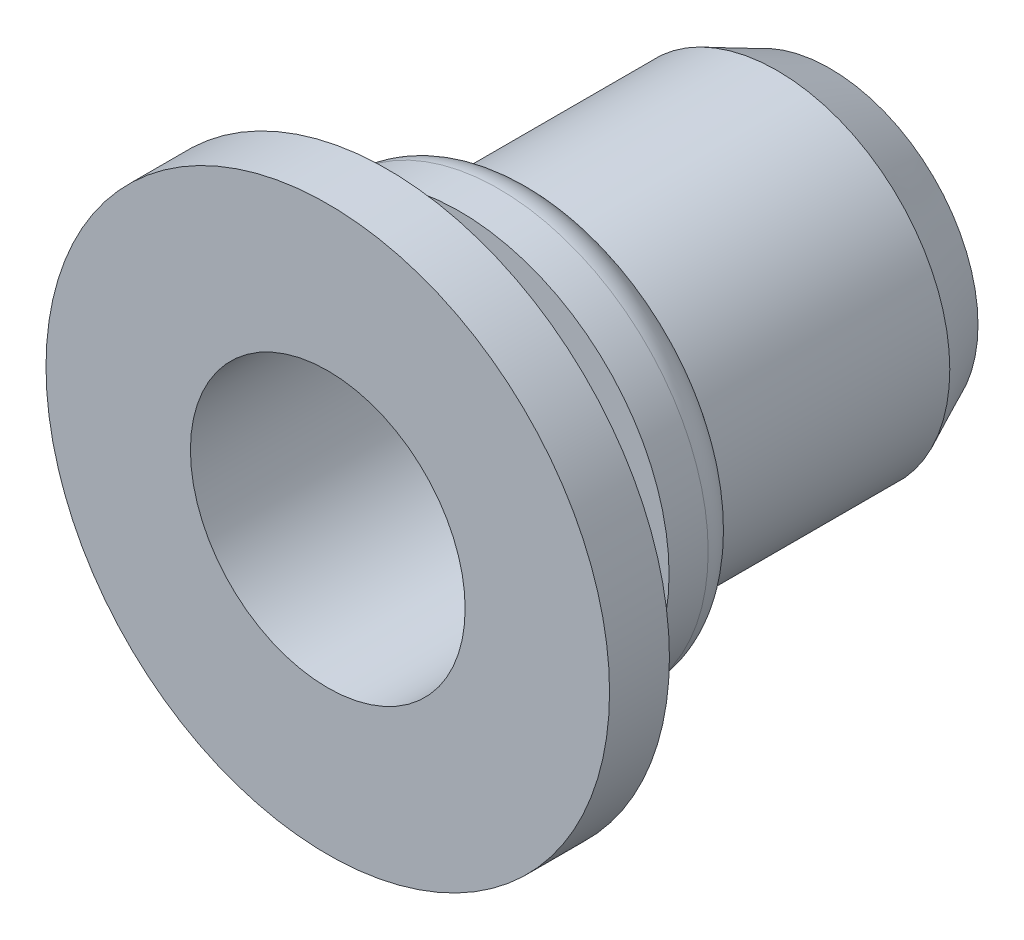
ISO-10303-21;
HEADER;
FILE_DESCRIPTION(('STEP AP214'),'2;1');
FILE_NAME('part.step','',(''),(''),'','','');
FILE_SCHEMA(('AUTOMOTIVE_DESIGN { 1 0 10303 214 1 1 1 1 }'));
ENDSEC;
DATA;
#1=APPLICATION_CONTEXT('core data for automotive mechanical design processes');
#2=APPLICATION_PROTOCOL_DEFINITION('international standard','automotive_design',2000,#1);
#3=PRODUCT_CONTEXT('',#1,'mechanical');
#4=PRODUCT('Part','Part','',(#3));
#5=PRODUCT_RELATED_PRODUCT_CATEGORY('part','',(#4));
#6=PRODUCT_DEFINITION_FORMATION('','',#4);
#7=PRODUCT_DEFINITION_CONTEXT('part definition',#1,'design');
#8=PRODUCT_DEFINITION('design','',#6,#7);
#9=PRODUCT_DEFINITION_SHAPE('','',#8);
#10=(LENGTH_UNIT() NAMED_UNIT(*) SI_UNIT(.MILLI.,.METRE.));
#11=(NAMED_UNIT(*) PLANE_ANGLE_UNIT() SI_UNIT($,.RADIAN.));
#12=(NAMED_UNIT(*) SI_UNIT($,.STERADIAN.) SOLID_ANGLE_UNIT());
#13=UNCERTAINTY_MEASURE_WITH_UNIT(LENGTH_MEASURE(1.E-05),#10,'distance_accuracy_value','');
#14=(GEOMETRIC_REPRESENTATION_CONTEXT(3) GLOBAL_UNCERTAINTY_ASSIGNED_CONTEXT((#13)) GLOBAL_UNIT_ASSIGNED_CONTEXT((#10,
#11,#12)) REPRESENTATION_CONTEXT('',''));
#15=CARTESIAN_POINT('',(0.,0.,0.));
#16=DIRECTION('',(0.,0.,1.));
#17=DIRECTION('',(1.,0.,0.));
#18=AXIS2_PLACEMENT_3D('',#15,#16,#17);
#19=CARTESIAN_POINT('',(0.,1.95,0.85));
#20=DIRECTION('',(0.,0.,-1.));
#21=DIRECTION('',(-1.,0.,0.));
#22=AXIS2_PLACEMENT_3D('',#19,#20,#21);
#23=PLANE('',#22);
#24=CARTESIAN_POINT('',(0.,0.,0.85));
#25=DIRECTION('',(0.,0.,1.));
#26=DIRECTION('',(1.,0.,0.));
#27=AXIS2_PLACEMENT_3D('',#24,#25,#26);
#28=CIRCLE('',#27,1.95);
#29=CARTESIAN_POINT('',(1.95,0.,0.85));
#30=VERTEX_POINT('',#29);
#31=EDGE_CURVE('E83',#30,#30,#28,.T.);
#32=ORIENTED_EDGE('',*,*,#31,.F.);
#33=EDGE_LOOP('',(#32));
#34=FACE_BOUND('',#33,.T.);
#35=CARTESIAN_POINT('',(0.,0.,0.85));
#36=DIRECTION('',(0.,0.,1.));
#37=DIRECTION('',(1.,0.,0.));
#38=AXIS2_PLACEMENT_3D('',#35,#36,#37);
#39=CIRCLE('',#38,4.);
#40=CARTESIAN_POINT('',(4.,0.,0.85));
#41=VERTEX_POINT('',#40);
#42=EDGE_CURVE('E10',#41,#41,#39,.T.);
#43=ORIENTED_EDGE('',*,*,#42,.T.);
#44=EDGE_LOOP('',(#43));
#45=FACE_BOUND('',#44,.T.);
#46=ADVANCED_FACE('F34',(#34,#45),#23,.F.);
#47=CARTESIAN_POINT('',(0.,0.,0.));
#48=DIRECTION('',(0.,0.,1.));
#49=DIRECTION('',(1.,0.,0.));
#50=AXIS2_PLACEMENT_3D('',#47,#48,#49);
#51=CYLINDRICAL_SURFACE('',#50,4.);
#52=ORIENTED_EDGE('',*,*,#42,.F.);
#53=EDGE_LOOP('',(#52));
#54=FACE_BOUND('',#53,.T.);
#55=CARTESIAN_POINT('',(0.,0.,0.));
#56=DIRECTION('',(0.,0.,1.));
#57=DIRECTION('',(1.,0.,0.));
#58=AXIS2_PLACEMENT_3D('',#55,#56,#57);
#59=CIRCLE('',#58,4.);
#60=CARTESIAN_POINT('',(4.,0.,0.));
#61=VERTEX_POINT('',#60);
#62=EDGE_CURVE('E40',#61,#61,#59,.T.);
#63=ORIENTED_EDGE('',*,*,#62,.T.);
#64=EDGE_LOOP('',(#63));
#65=FACE_BOUND('',#64,.T.);
#66=ADVANCED_FACE('F90',(#54,#65),#51,.T.);
#67=CARTESIAN_POINT('',(0.,4.,0.));
#68=DIRECTION('',(0.,0.,1.));
#69=DIRECTION('',(1.,0.,0.));
#70=AXIS2_PLACEMENT_3D('',#67,#68,#69);
#71=PLANE('',#70);
#72=ORIENTED_EDGE('',*,*,#62,.F.);
#73=EDGE_LOOP('',(#72));
#74=FACE_BOUND('',#73,.T.);
#75=CARTESIAN_POINT('',(0.,0.,0.));
#76=DIRECTION('',(0.,0.,1.));
#77=DIRECTION('',(1.,0.,0.));
#78=AXIS2_PLACEMENT_3D('',#75,#76,#77);
#79=CIRCLE('',#78,2.45);
#80=CARTESIAN_POINT('',(2.45,0.,0.));
#81=VERTEX_POINT('',#80);
#82=EDGE_CURVE('E44',#81,#81,#79,.T.);
#83=ORIENTED_EDGE('',*,*,#82,.T.);
#84=EDGE_LOOP('',(#83));
#85=FACE_BOUND('',#84,.T.);
#86=ADVANCED_FACE('F94',(#74,#85),#71,.F.);
#87=CARTESIAN_POINT('',(0.,0.,0.));
#88=DIRECTION('',(0.,0.,1.));
#89=DIRECTION('',(1.,0.,0.));
#90=AXIS2_PLACEMENT_3D('',#87,#88,#89);
#91=CYLINDRICAL_SURFACE('',#90,2.45);
#92=ORIENTED_EDGE('',*,*,#82,.F.);
#93=EDGE_LOOP('',(#92));
#94=FACE_BOUND('',#93,.T.);
#95=CARTESIAN_POINT('',(0.,0.,-1.02));
#96=DIRECTION('',(0.,0.,1.));
#97=DIRECTION('',(1.,0.,0.));
#98=AXIS2_PLACEMENT_3D('',#95,#96,#97);
#99=CIRCLE('',#98,2.45);
#100=CARTESIAN_POINT('',(2.45,0.,-1.02));
#101=VERTEX_POINT('',#100);
#102=EDGE_CURVE('E48',#101,#101,#99,.T.);
#103=ORIENTED_EDGE('',*,*,#102,.T.);
#104=EDGE_LOOP('',(#103));
#105=FACE_BOUND('',#104,.T.);
#106=ADVANCED_FACE('F99',(#94,#105),#91,.T.);
#107=CARTESIAN_POINT('',(0.,2.45,-1.02));
#108=DIRECTION('',(0.,0.,-1.));
#109=DIRECTION('',(-1.,0.,0.));
#110=AXIS2_PLACEMENT_3D('',#107,#108,#109);
#111=PLANE('',#110);
#112=ORIENTED_EDGE('',*,*,#102,.F.);
#113=EDGE_LOOP('',(#112));
#114=FACE_BOUND('',#113,.T.);
#115=CARTESIAN_POINT('',(0.,0.,-1.02));
#116=DIRECTION('',(0.,0.,1.));
#117=DIRECTION('',(1.,0.,0.));
#118=AXIS2_PLACEMENT_3D('',#115,#116,#117);
#119=CIRCLE('',#118,2.975);
#120=CARTESIAN_POINT('',(2.975,0.,-1.02));
#121=VERTEX_POINT('',#120);
#122=EDGE_CURVE('E53',#121,#121,#119,.T.);
#123=ORIENTED_EDGE('',*,*,#122,.T.);
#124=EDGE_LOOP('',(#123));
#125=FACE_BOUND('',#124,.T.);
#126=ADVANCED_FACE('F105',(#114,#125),#111,.F.);
#127=CARTESIAN_POINT('',(0.,0.,0.));
#128=DIRECTION('',(0.,0.,1.));
#129=DIRECTION('',(1.,0.,0.));
#130=AXIS2_PLACEMENT_3D('',#127,#128,#129);
#131=CYLINDRICAL_SURFACE('',#130,2.975);
#132=ORIENTED_EDGE('',*,*,#122,.F.);
#133=EDGE_LOOP('',(#132));
#134=FACE_BOUND('',#133,.T.);
#135=CARTESIAN_POINT('',(0.,0.,-1.575));
#136=DIRECTION('',(0.,0.,1.));
#137=DIRECTION('',(1.,0.,0.));
#138=AXIS2_PLACEMENT_3D('',#135,#136,#137);
#139=CIRCLE('',#138,2.975);
#140=CARTESIAN_POINT('',(2.975,0.,-1.575));
#141=VERTEX_POINT('',#140);
#142=EDGE_CURVE('E56',#141,#141,#139,.T.);
#143=ORIENTED_EDGE('',*,*,#142,.T.);
#144=EDGE_LOOP('',(#143));
#145=FACE_BOUND('',#144,.T.);
#146=ADVANCED_FACE('F109',(#134,#145),#131,.T.);
#147=CARTESIAN_POINT('',(0.,0.,-1.575));
#148=DIRECTION('',(0.,0.,1.));
#149=DIRECTION('',(1.,0.,0.));
#150=AXIS2_PLACEMENT_3D('',#147,#148,#149);
#151=TOROIDAL_SURFACE('',#150,2.45,0.525);
#152=ORIENTED_EDGE('',*,*,#142,.F.);
#153=EDGE_LOOP('',(#152));
#154=FACE_BOUND('',#153,.T.);
#155=CARTESIAN_POINT('',(0.,0.,-2.1));
#156=DIRECTION('',(0.,0.,1.));
#157=DIRECTION('',(1.,0.,0.));
#158=AXIS2_PLACEMENT_3D('',#155,#156,#157);
#159=CIRCLE('',#158,2.45);
#160=CARTESIAN_POINT('',(2.45,0.,-2.1));
#161=VERTEX_POINT('',#160);
#162=EDGE_CURVE('E59',#161,#161,#159,.T.);
#163=ORIENTED_EDGE('',*,*,#162,.T.);
#164=EDGE_LOOP('',(#163));
#165=FACE_BOUND('',#164,.T.);
#166=ADVANCED_FACE('F113',(#154,#165),#151,.T.);
#167=CARTESIAN_POINT('',(0.,0.,0.));
#168=DIRECTION('',(0.,0.,1.));
#169=DIRECTION('',(1.,0.,0.));
#170=AXIS2_PLACEMENT_3D('',#167,#168,#169);
#171=CYLINDRICAL_SURFACE('',#170,2.45);
#172=ORIENTED_EDGE('',*,*,#162,.F.);
#173=EDGE_LOOP('',(#172));
#174=FACE_BOUND('',#173,.T.);
#175=CARTESIAN_POINT('',(0.,0.,-5.53));
#176=DIRECTION('',(0.,0.,1.));
#177=DIRECTION('',(1.,0.,0.));
#178=AXIS2_PLACEMENT_3D('',#175,#176,#177);
#179=CIRCLE('',#178,2.45);
#180=CARTESIAN_POINT('',(2.45,0.,-5.53));
#181=VERTEX_POINT('',#180);
#182=EDGE_CURVE('E62',#181,#181,#179,.T.);
#183=ORIENTED_EDGE('',*,*,#182,.T.);
#184=EDGE_LOOP('',(#183));
#185=FACE_BOUND('',#184,.T.);
#186=ADVANCED_FACE('F117',(#174,#185),#171,.T.);
#187=CARTESIAN_POINT('',(0.,0.,-6.28));
#188=DIRECTION('',(0.,0.,1.));
#189=DIRECTION('',(1.,0.,0.));
#190=AXIS2_PLACEMENT_3D('',#187,#188,#189);
#191=CONICAL_SURFACE('',#190,2.10026925638375,0.436332312998583);
#192=ORIENTED_EDGE('',*,*,#182,.F.);
#193=EDGE_LOOP('',(#192));
#194=FACE_BOUND('',#193,.T.);
#195=CARTESIAN_POINT('',(0.,0.,-6.28));
#196=DIRECTION('',(0.,0.,1.));
#197=DIRECTION('',(1.,0.,0.));
#198=AXIS2_PLACEMENT_3D('',#195,#196,#197);
#199=CIRCLE('',#198,2.10026925638375);
#200=CARTESIAN_POINT('',(2.10026925638375,0.,-6.28));
#201=VERTEX_POINT('',#200);
#202=EDGE_CURVE('E65',#201,#201,#199,.T.);
#203=ORIENTED_EDGE('',*,*,#202,.T.);
#204=EDGE_LOOP('',(#203));
#205=FACE_BOUND('',#204,.T.);
#206=ADVANCED_FACE('F121',(#194,#205),#191,.T.);
#207=CARTESIAN_POINT('',(0.,2.10026925638375,-6.28));
#208=DIRECTION('',(0.,0.,1.));
#209=DIRECTION('',(1.,0.,0.));
#210=AXIS2_PLACEMENT_3D('',#207,#208,#209);
#211=PLANE('',#210);
#212=ORIENTED_EDGE('',*,*,#202,.F.);
#213=EDGE_LOOP('',(#212));
#214=FACE_BOUND('',#213,.T.);
#215=CARTESIAN_POINT('',(0.,0.,-6.28));
#216=DIRECTION('',(0.,0.,1.));
#217=DIRECTION('',(1.,0.,0.));
#218=AXIS2_PLACEMENT_3D('',#215,#216,#217);
#219=CIRCLE('',#218,1.5);
#220=CARTESIAN_POINT('',(1.5,0.,-6.28));
#221=VERTEX_POINT('',#220);
#222=EDGE_CURVE('E68',#221,#221,#219,.T.);
#223=ORIENTED_EDGE('',*,*,#222,.T.);
#224=EDGE_LOOP('',(#223));
#225=FACE_BOUND('',#224,.T.);
#226=ADVANCED_FACE('F125',(#214,#225),#211,.F.);
#227=CARTESIAN_POINT('',(0.,0.,-6.1238267521842));
#228=DIRECTION('',(0.,0.,-1.));
#229=DIRECTION('',(-1.,0.,0.));
#230=AXIS2_PLACEMENT_3D('',#227,#228,#229);
#231=CONICAL_SURFACE('',#230,1.2295,1.04719755119659);
#232=ORIENTED_EDGE('',*,*,#222,.F.);
#233=EDGE_LOOP('',(#232));
#234=FACE_BOUND('',#233,.T.);
#235=CARTESIAN_POINT('',(0.,0.,-6.1238267521842));
#236=DIRECTION('',(0.,0.,1.));
#237=DIRECTION('',(1.,0.,0.));
#238=AXIS2_PLACEMENT_3D('',#235,#236,#237);
#239=CIRCLE('',#238,1.2295);
#240=CARTESIAN_POINT('',(1.2295,0.,-6.1238267521842));
#241=VERTEX_POINT('',#240);
#242=EDGE_CURVE('E71',#241,#241,#239,.T.);
#243=ORIENTED_EDGE('',*,*,#242,.T.);
#244=EDGE_LOOP('',(#243));
#245=FACE_BOUND('',#244,.T.);
#246=ADVANCED_FACE('F129',(#234,#245),#231,.F.);
#247=CARTESIAN_POINT('',(0.,0.,0.));
#248=DIRECTION('',(0.,0.,1.));
#249=DIRECTION('',(1.,0.,0.));
#250=AXIS2_PLACEMENT_3D('',#247,#248,#249);
#251=CYLINDRICAL_SURFACE('',#250,1.2295);
#252=ORIENTED_EDGE('',*,*,#242,.F.);
#253=EDGE_LOOP('',(#252));
#254=FACE_BOUND('',#253,.T.);
#255=CARTESIAN_POINT('',(0.,0.,-2.18617324781579));
#256=DIRECTION('',(0.,0.,1.));
#257=DIRECTION('',(1.,0.,0.));
#258=AXIS2_PLACEMENT_3D('',#255,#256,#257);
#259=CIRCLE('',#258,1.2295);
#260=CARTESIAN_POINT('',(1.2295,0.,-2.18617324781579));
#261=VERTEX_POINT('',#260);
#262=EDGE_CURVE('E74',#261,#261,#259,.T.);
#263=ORIENTED_EDGE('',*,*,#262,.T.);
#264=EDGE_LOOP('',(#263));
#265=FACE_BOUND('',#264,.T.);
#266=ADVANCED_FACE('F133',(#254,#265),#251,.F.);
#267=CARTESIAN_POINT('',(0.,0.,-2.03));
#268=DIRECTION('',(0.,0.,1.));
#269=DIRECTION('',(1.,0.,0.));
#270=AXIS2_PLACEMENT_3D('',#267,#268,#269);
#271=CONICAL_SURFACE('',#270,1.5,1.0471975511966);
#272=ORIENTED_EDGE('',*,*,#262,.F.);
#273=EDGE_LOOP('',(#272));
#274=FACE_BOUND('',#273,.T.);
#275=CARTESIAN_POINT('',(0.,0.,-2.03));
#276=DIRECTION('',(0.,0.,1.));
#277=DIRECTION('',(1.,0.,0.));
#278=AXIS2_PLACEMENT_3D('',#275,#276,#277);
#279=CIRCLE('',#278,1.5);
#280=CARTESIAN_POINT('',(1.5,0.,-2.03));
#281=VERTEX_POINT('',#280);
#282=EDGE_CURVE('E77',#281,#281,#279,.T.);
#283=ORIENTED_EDGE('',*,*,#282,.T.);
#284=EDGE_LOOP('',(#283));
#285=FACE_BOUND('',#284,.T.);
#286=ADVANCED_FACE('F137',(#274,#285),#271,.F.);
#287=CARTESIAN_POINT('',(0.,1.95,-2.03));
#288=DIRECTION('',(0.,0.,-1.));
#289=DIRECTION('',(-1.,0.,0.));
#290=AXIS2_PLACEMENT_3D('',#287,#288,#289);
#291=PLANE('',#290);
#292=ORIENTED_EDGE('',*,*,#282,.F.);
#293=EDGE_LOOP('',(#292));
#294=FACE_BOUND('',#293,.T.);
#295=CARTESIAN_POINT('',(0.,0.,-2.03));
#296=DIRECTION('',(0.,0.,1.));
#297=DIRECTION('',(1.,0.,0.));
#298=AXIS2_PLACEMENT_3D('',#295,#296,#297);
#299=CIRCLE('',#298,1.95);
#300=CARTESIAN_POINT('',(1.95,0.,-2.03));
#301=VERTEX_POINT('',#300);
#302=EDGE_CURVE('E80',#301,#301,#299,.T.);
#303=ORIENTED_EDGE('',*,*,#302,.T.);
#304=EDGE_LOOP('',(#303));
#305=FACE_BOUND('',#304,.T.);
#306=ADVANCED_FACE('F141',(#294,#305),#291,.F.);
#307=CARTESIAN_POINT('',(0.,0.,0.));
#308=DIRECTION('',(0.,0.,1.));
#309=DIRECTION('',(1.,0.,0.));
#310=AXIS2_PLACEMENT_3D('',#307,#308,#309);
#311=CYLINDRICAL_SURFACE('',#310,1.95);
#312=ORIENTED_EDGE('',*,*,#302,.F.);
#313=EDGE_LOOP('',(#312));
#314=FACE_BOUND('',#313,.T.);
#315=ORIENTED_EDGE('',*,*,#31,.T.);
#316=EDGE_LOOP('',(#315));
#317=FACE_BOUND('',#316,.T.);
#318=ADVANCED_FACE('F87',(#314,#317),#311,.F.);
#319=CLOSED_SHELL('',(#46,#66,#86,#106,#126,#146,#166,#186,#206,#226,#246,#266,#286,#306,#318));
#320=MANIFOLD_SOLID_BREP('B2',#319);
#321=ADVANCED_BREP_SHAPE_REPRESENTATION('',(#18,#320),#14);
#322=SHAPE_DEFINITION_REPRESENTATION(#9,#321);
ENDSEC;
END-ISO-10303-21;
